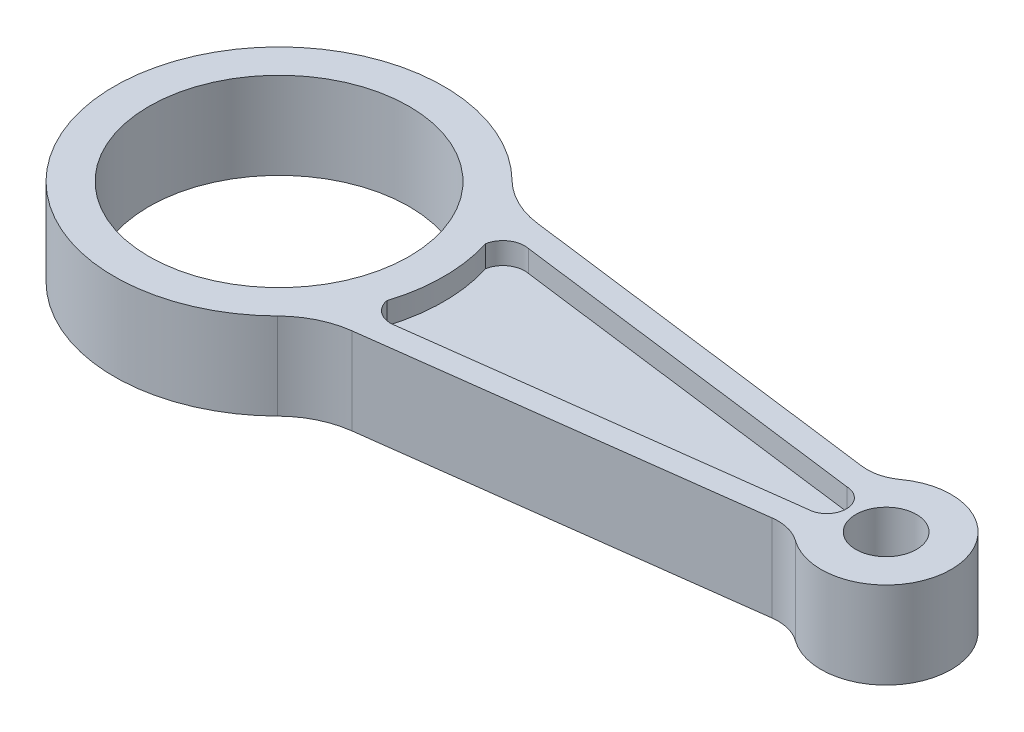
ISO-10303-21;
HEADER;
FILE_DESCRIPTION(('STEP AP214'),'2;1');
FILE_NAME('part.step','',(''),(''),'','','');
FILE_SCHEMA(('AUTOMOTIVE_DESIGN { 1 0 10303 214 1 1 1 1 }'));
ENDSEC;
DATA;
#1=APPLICATION_CONTEXT('core data for automotive mechanical design processes');
#2=APPLICATION_PROTOCOL_DEFINITION('international standard','automotive_design',2000,#1);
#3=PRODUCT_CONTEXT('',#1,'mechanical');
#4=PRODUCT('Part','Part','',(#3));
#5=PRODUCT_RELATED_PRODUCT_CATEGORY('part','',(#4));
#6=PRODUCT_DEFINITION_FORMATION('','',#4);
#7=PRODUCT_DEFINITION_CONTEXT('part definition',#1,'design');
#8=PRODUCT_DEFINITION('design','',#6,#7);
#9=PRODUCT_DEFINITION_SHAPE('','',#8);
#10=(LENGTH_UNIT() NAMED_UNIT(*) SI_UNIT(.MILLI.,.METRE.));
#11=(NAMED_UNIT(*) PLANE_ANGLE_UNIT() SI_UNIT($,.RADIAN.));
#12=(NAMED_UNIT(*) SI_UNIT($,.STERADIAN.) SOLID_ANGLE_UNIT());
#13=UNCERTAINTY_MEASURE_WITH_UNIT(LENGTH_MEASURE(1.E-05),#10,'distance_accuracy_value','');
#14=(GEOMETRIC_REPRESENTATION_CONTEXT(3) GLOBAL_UNCERTAINTY_ASSIGNED_CONTEXT((#13)) GLOBAL_UNIT_ASSIGNED_CONTEXT((#10,
#11,#12)) REPRESENTATION_CONTEXT('',''));
#15=CARTESIAN_POINT('',(0.,0.,0.));
#16=DIRECTION('',(0.,0.,1.));
#17=DIRECTION('',(1.,0.,0.));
#18=AXIS2_PLACEMENT_3D('',#15,#16,#17);
#19=CARTESIAN_POINT('',(0.,10.,0.));
#20=DIRECTION('',(0.,1.,0.));
#21=DIRECTION('',(0.,0.,1.));
#22=AXIS2_PLACEMENT_3D('',#19,#20,#21);
#23=PLANE('',#22);
#24=CARTESIAN_POINT('',(140.,10.,0.));
#25=DIRECTION('',(0.,1.,0.));
#26=DIRECTION('',(0.,0.,1.));
#27=AXIS2_PLACEMENT_3D('',#24,#25,#26);
#28=CIRCLE('',#27,7.00000000000001);
#29=CARTESIAN_POINT('',(140.,10.,7.00000000000001));
#30=VERTEX_POINT('',#29);
#31=EDGE_CURVE('E192',#30,#30,#28,.T.);
#32=ORIENTED_EDGE('',*,*,#31,.F.);
#33=EDGE_LOOP('',(#32));
#34=FACE_BOUND('',#33,.T.);
#35=DIRECTION('',(-0.991780070235736,0.,-0.127954258558278));
#36=VECTOR('',#35,1.);
#37=CARTESIAN_POINT('',(30.700703588536,10.,-22.3934543822263));
#38=LINE('',#37,#36);
#39=CARTESIAN_POINT('',(124.079148067427,10.,-10.3462576425481));
#40=VERTEX_POINT('',#39);
#41=CARTESIAN_POINT('',(38.2025768051587,10.,-21.4256020790408));
#42=VERTEX_POINT('',#41);
#43=EDGE_CURVE('E213',#40,#42,#38,.T.);
#44=ORIENTED_EDGE('',*,*,#43,.T.);
#45=CARTESIAN_POINT('',(40.7616619763243,10.,-41.2612034837555));
#46=DIRECTION('',(0.,1.,0.));
#47=DIRECTION('',(0.,0.,1.));
#48=AXIS2_PLACEMENT_3D('',#45,#46,#47);
#49=CIRCLE('',#48,20.);
#50=CARTESIAN_POINT('',(26.705916467247,10.,-27.0332022824605));
#51=VERTEX_POINT('',#50);
#52=EDGE_CURVE('E11',#42,#51,#49,.F.);
#53=ORIENTED_EDGE('',*,*,#52,.T.);
#54=CARTESIAN_POINT('',(0.,10.,0.));
#55=DIRECTION('',(0.,1.,0.));
#56=DIRECTION('',(0.,0.,1.));
#57=AXIS2_PLACEMENT_3D('',#54,#55,#56);
#58=CIRCLE('',#57,38.);
#59=CARTESIAN_POINT('',(26.705916467247,10.,27.0332022824605));
#60=VERTEX_POINT('',#59);
#61=EDGE_CURVE('E204',#51,#60,#58,.T.);
#62=ORIENTED_EDGE('',*,*,#61,.T.);
#63=CARTESIAN_POINT('',(40.7616619763243,10.,41.2612034837555));
#64=DIRECTION('',(0.,1.,0.));
#65=DIRECTION('',(0.,0.,1.));
#66=AXIS2_PLACEMENT_3D('',#63,#64,#65);
#67=CIRCLE('',#66,20.);
#68=CARTESIAN_POINT('',(38.2025768051587,10.,21.4256020790408));
#69=VERTEX_POINT('',#68);
#70=EDGE_CURVE('E256',#60,#69,#67,.F.);
#71=ORIENTED_EDGE('',*,*,#70,.T.);
#72=DIRECTION('',(0.991780070235736,0.,-0.127954258558278));
#73=VECTOR('',#72,1.);
#74=CARTESIAN_POINT('',(30.700703588536,10.,22.3934543822263));
#75=LINE('',#74,#73);
#76=CARTESIAN_POINT('',(124.079148067427,10.,10.3462576425481));
#77=VERTEX_POINT('',#76);
#78=EDGE_CURVE('E207',#69,#77,#75,.T.);
#79=ORIENTED_EDGE('',*,*,#78,.T.);
#80=CARTESIAN_POINT('',(125.35869065301,10.,20.2640583449055));
#81=DIRECTION('',(0.,1.,0.));
#82=DIRECTION('',(0.,0.,1.));
#83=AXIS2_PLACEMENT_3D('',#80,#81,#82);
#84=CIRCLE('',#83,10.);
#85=CARTESIAN_POINT('',(131.215214391806,10.,12.1584350069433));
#86=VERTEX_POINT('',#85);
#87=EDGE_CURVE('E238',#77,#86,#84,.F.);
#88=ORIENTED_EDGE('',*,*,#87,.T.);
#89=CARTESIAN_POINT('',(140.,10.,0.));
#90=DIRECTION('',(0.,1.,0.));
#91=DIRECTION('',(0.,0.,-1.));
#92=AXIS2_PLACEMENT_3D('',#89,#90,#91);
#93=CIRCLE('',#92,15.);
#94=CARTESIAN_POINT('',(131.215214391806,10.,-12.1584350069433));
#95=VERTEX_POINT('',#94);
#96=EDGE_CURVE('E210',#86,#95,#93,.T.);
#97=ORIENTED_EDGE('',*,*,#96,.T.);
#98=CARTESIAN_POINT('',(125.35869065301,10.,-20.2640583449055));
#99=DIRECTION('',(0.,1.,0.));
#100=DIRECTION('',(0.,0.,1.));
#101=AXIS2_PLACEMENT_3D('',#98,#99,#100);
#102=CIRCLE('',#101,10.);
#103=EDGE_CURVE('E242',#95,#40,#102,.F.);
#104=ORIENTED_EDGE('',*,*,#103,.T.);
#105=EDGE_LOOP('',(#44,#53,#62,#71,#79,#88,#97,#104));
#106=FACE_BOUND('',#105,.T.);
#107=CARTESIAN_POINT('',(0.,10.,0.));
#108=DIRECTION('',(0.,1.,0.));
#109=DIRECTION('',(0.,0.,1.));
#110=AXIS2_PLACEMENT_3D('',#107,#108,#109);
#111=CIRCLE('',#110,30.);
#112=CARTESIAN_POINT('',(0.,10.,30.));
#113=VERTEX_POINT('',#112);
#114=EDGE_CURVE('E198',#113,#113,#111,.T.);
#115=ORIENTED_EDGE('',*,*,#114,.F.);
#116=EDGE_LOOP('',(#115));
#117=FACE_BOUND('',#116,.T.);
#118=CARTESIAN_POINT('',(41.1592606303604,10.,-10.4663537764258));
#119=DIRECTION('',(0.,1.,0.));
#120=DIRECTION('',(0.,0.,-1.));
#121=AXIS2_PLACEMENT_3D('',#118,#119,#120);
#122=CIRCLE('',#121,5.);
#123=CARTESIAN_POINT('',(42.097828348482,10.,-15.377472858519));
#124=VERTEX_POINT('',#123);
#125=CARTESIAN_POINT('',(36.2481415482672,10.,-11.4049214945473));
#126=VERTEX_POINT('',#125);
#127=EDGE_CURVE('E52',#124,#126,#122,.T.);
#128=ORIENTED_EDGE('',*,*,#127,.F.);
#129=DIRECTION('',(-0.991780070235736,0.,-0.127954258558278));
#130=VECTOR('',#129,1.);
#131=CARTESIAN_POINT('',(42.097828348482,10.,-15.377472858519));
#132=LINE('',#131,#130);
#133=CARTESIAN_POINT('',(126.41828508729,10.,-4.49889014940578));
#134=VERTEX_POINT('',#133);
#135=EDGE_CURVE('E158',#134,#124,#132,.T.);
#136=ORIENTED_EDGE('',*,*,#135,.F.);
#137=CARTESIAN_POINT('',(126.318347989175,10.,0.));
#138=DIRECTION('',(0.,1.,0.));
#139=DIRECTION('',(0.,0.,-1.));
#140=AXIS2_PLACEMENT_3D('',#137,#138,#139);
#141=CIRCLE('',#140,4.5);
#142=CARTESIAN_POINT('',(126.41828508729,10.,4.49889014940578));
#143=VERTEX_POINT('',#142);
#144=EDGE_CURVE('E161',#143,#134,#141,.T.);
#145=ORIENTED_EDGE('',*,*,#144,.F.);
#146=DIRECTION('',(0.991780070235736,0.,-0.127954258558278));
#147=VECTOR('',#146,1.);
#148=CARTESIAN_POINT('',(42.097828348482,10.,15.377472858519));
#149=LINE('',#148,#147);
#150=CARTESIAN_POINT('',(42.097828348482,10.,15.377472858519));
#151=VERTEX_POINT('',#150);
#152=EDGE_CURVE('E177',#151,#143,#149,.T.);
#153=ORIENTED_EDGE('',*,*,#152,.F.);
#154=CARTESIAN_POINT('',(41.1592606303604,10.,10.4663537764258));
#155=DIRECTION('',(0.,1.,0.));
#156=DIRECTION('',(0.,0.,1.));
#157=AXIS2_PLACEMENT_3D('',#154,#155,#156);
#158=CIRCLE('',#157,5.);
#159=CARTESIAN_POINT('',(36.2481415482672,10.,11.4049214945473));
#160=VERTEX_POINT('',#159);
#161=EDGE_CURVE('E174',#160,#151,#158,.T.);
#162=ORIENTED_EDGE('',*,*,#161,.F.);
#163=CARTESIAN_POINT('',(0.,10.,0.));
#164=DIRECTION('',(0.,-1.,0.));
#165=DIRECTION('',(0.,0.,-1.));
#166=AXIS2_PLACEMENT_3D('',#163,#164,#165);
#167=CIRCLE('',#166,38.);
#168=EDGE_CURVE('E172',#126,#160,#167,.T.);
#169=ORIENTED_EDGE('',*,*,#168,.F.);
#170=EDGE_LOOP('',(#128,#136,#145,#153,#162,#169));
#171=FACE_BOUND('',#170,.T.);
#172=ADVANCED_FACE('F37',(#34,#106,#117,#171),#23,.T.);
#173=CARTESIAN_POINT('',(0.,-10.,0.));
#174=DIRECTION('',(0.,1.,0.));
#175=DIRECTION('',(0.,0.,1.));
#176=AXIS2_PLACEMENT_3D('',#173,#174,#175);
#177=PLANE('',#176);
#178=CARTESIAN_POINT('',(0.,-10.,0.));
#179=DIRECTION('',(0.,1.,0.));
#180=DIRECTION('',(0.,0.,1.));
#181=AXIS2_PLACEMENT_3D('',#178,#179,#180);
#182=CIRCLE('',#181,38.);
#183=CARTESIAN_POINT('',(26.705916467247,-10.,-27.0332022824605));
#184=VERTEX_POINT('',#183);
#185=CARTESIAN_POINT('',(26.705916467247,-10.,27.0332022824605));
#186=VERTEX_POINT('',#185);
#187=EDGE_CURVE('E201',#184,#186,#182,.T.);
#188=ORIENTED_EDGE('',*,*,#187,.F.);
#189=CARTESIAN_POINT('',(40.7616619763243,-10.,-41.2612034837555));
#190=DIRECTION('',(0.,1.,0.));
#191=DIRECTION('',(0.,0.,1.));
#192=AXIS2_PLACEMENT_3D('',#189,#190,#191);
#193=CIRCLE('',#192,20.);
#194=CARTESIAN_POINT('',(38.2025768051587,-10.,-21.4256020790408));
#195=VERTEX_POINT('',#194);
#196=EDGE_CURVE('E45',#184,#195,#193,.T.);
#197=ORIENTED_EDGE('',*,*,#196,.T.);
#198=DIRECTION('',(-0.991780070235736,0.,-0.127954258558278));
#199=VECTOR('',#198,1.);
#200=CARTESIAN_POINT('',(30.700703588536,-10.,-22.3934543822263));
#201=LINE('',#200,#199);
#202=CARTESIAN_POINT('',(124.079148067427,-10.,-10.3462576425481));
#203=VERTEX_POINT('',#202);
#204=EDGE_CURVE('E208',#203,#195,#201,.T.);
#205=ORIENTED_EDGE('',*,*,#204,.F.);
#206=CARTESIAN_POINT('',(125.35869065301,-10.,-20.2640583449055));
#207=DIRECTION('',(0.,1.,0.));
#208=DIRECTION('',(0.,0.,1.));
#209=AXIS2_PLACEMENT_3D('',#206,#207,#208);
#210=CIRCLE('',#209,10.);
#211=CARTESIAN_POINT('',(131.215214391806,-10.,-12.1584350069433));
#212=VERTEX_POINT('',#211);
#213=EDGE_CURVE('E240',#203,#212,#210,.T.);
#214=ORIENTED_EDGE('',*,*,#213,.T.);
#215=CARTESIAN_POINT('',(140.,-10.,0.));
#216=DIRECTION('',(0.,1.,0.));
#217=DIRECTION('',(0.,0.,-1.));
#218=AXIS2_PLACEMENT_3D('',#215,#216,#217);
#219=CIRCLE('',#218,15.);
#220=CARTESIAN_POINT('',(131.215214391806,-10.,12.1584350069433));
#221=VERTEX_POINT('',#220);
#222=EDGE_CURVE('E221',#221,#212,#219,.T.);
#223=ORIENTED_EDGE('',*,*,#222,.F.);
#224=CARTESIAN_POINT('',(125.35869065301,-10.,20.2640583449055));
#225=DIRECTION('',(0.,1.,0.));
#226=DIRECTION('',(0.,0.,1.));
#227=AXIS2_PLACEMENT_3D('',#224,#225,#226);
#228=CIRCLE('',#227,10.);
#229=CARTESIAN_POINT('',(124.079148067427,-10.,10.3462576425481));
#230=VERTEX_POINT('',#229);
#231=EDGE_CURVE('E235',#221,#230,#228,.T.);
#232=ORIENTED_EDGE('',*,*,#231,.T.);
#233=DIRECTION('',(0.991780070235736,0.,-0.127954258558278));
#234=VECTOR('',#233,1.);
#235=CARTESIAN_POINT('',(30.700703588536,-10.,22.3934543822263));
#236=LINE('',#235,#234);
#237=CARTESIAN_POINT('',(38.2025768051587,-10.,21.4256020790408));
#238=VERTEX_POINT('',#237);
#239=EDGE_CURVE('E219',#238,#230,#236,.T.);
#240=ORIENTED_EDGE('',*,*,#239,.F.);
#241=CARTESIAN_POINT('',(40.7616619763243,-10.,41.2612034837555));
#242=DIRECTION('',(0.,1.,0.));
#243=DIRECTION('',(0.,0.,1.));
#244=AXIS2_PLACEMENT_3D('',#241,#242,#243);
#245=CIRCLE('',#244,20.);
#246=EDGE_CURVE('E254',#238,#186,#245,.T.);
#247=ORIENTED_EDGE('',*,*,#246,.T.);
#248=EDGE_LOOP('',(#188,#197,#205,#214,#223,#232,#240,#247));
#249=FACE_BOUND('',#248,.T.);
#250=CARTESIAN_POINT('',(0.,-10.,0.));
#251=DIRECTION('',(0.,1.,0.));
#252=DIRECTION('',(0.,0.,1.));
#253=AXIS2_PLACEMENT_3D('',#250,#251,#252);
#254=CIRCLE('',#253,30.);
#255=CARTESIAN_POINT('',(0.,-10.,30.));
#256=VERTEX_POINT('',#255);
#257=EDGE_CURVE('E195',#256,#256,#254,.T.);
#258=ORIENTED_EDGE('',*,*,#257,.T.);
#259=EDGE_LOOP('',(#258));
#260=FACE_BOUND('',#259,.T.);
#261=CARTESIAN_POINT('',(140.,-10.,0.));
#262=DIRECTION('',(0.,1.,0.));
#263=DIRECTION('',(0.,0.,1.));
#264=AXIS2_PLACEMENT_3D('',#261,#262,#263);
#265=CIRCLE('',#264,7.00000000000001);
#266=CARTESIAN_POINT('',(140.,-10.,7.00000000000001));
#267=VERTEX_POINT('',#266);
#268=EDGE_CURVE('E184',#267,#267,#265,.T.);
#269=ORIENTED_EDGE('',*,*,#268,.T.);
#270=EDGE_LOOP('',(#269));
#271=FACE_BOUND('',#270,.T.);
#272=ADVANCED_FACE('F271',(#249,#260,#271),#177,.F.);
#273=CARTESIAN_POINT('',(0.,10.,0.));
#274=DIRECTION('',(0.,-1.,0.));
#275=DIRECTION('',(0.,0.,-1.));
#276=AXIS2_PLACEMENT_3D('',#273,#274,#275);
#277=CYLINDRICAL_SURFACE('',#276,38.);
#278=ORIENTED_EDGE('',*,*,#187,.T.);
#279=DIRECTION('',(0.,-1.,0.));
#280=VECTOR('',#279,1.);
#281=CARTESIAN_POINT('',(26.705916467247,10.,27.0332022824605));
#282=LINE('',#281,#280);
#283=EDGE_CURVE('E250',#186,#60,#282,.F.);
#284=ORIENTED_EDGE('',*,*,#283,.T.);
#285=ORIENTED_EDGE('',*,*,#61,.F.);
#286=DIRECTION('',(0.,-1.,0.));
#287=VECTOR('',#286,1.);
#288=CARTESIAN_POINT('',(26.705916467247,10.,-27.0332022824605));
#289=LINE('',#288,#287);
#290=EDGE_CURVE('E247',#51,#184,#289,.T.);
#291=ORIENTED_EDGE('',*,*,#290,.T.);
#292=EDGE_LOOP('',(#278,#284,#285,#291));
#293=FACE_BOUND('',#292,.T.);
#294=ADVANCED_FACE('F274',(#293),#277,.T.);
#295=CARTESIAN_POINT('',(30.700703588536,10.,22.3934543822263));
#296=DIRECTION('',(-0.127954258558278,0.,-0.991780070235736));
#297=DIRECTION('',(-0.991780070235736,0.,0.127954258558278));
#298=AXIS2_PLACEMENT_3D('',#295,#296,#297);
#299=PLANE('',#298);
#300=ORIENTED_EDGE('',*,*,#78,.F.);
#301=DIRECTION('',(0.,1.,0.));
#302=VECTOR('',#301,1.);
#303=CARTESIAN_POINT('',(38.2025768051587,-10.,21.4256020790408));
#304=LINE('',#303,#302);
#305=EDGE_CURVE('E244',#69,#238,#304,.F.);
#306=ORIENTED_EDGE('',*,*,#305,.T.);
#307=ORIENTED_EDGE('',*,*,#239,.T.);
#308=DIRECTION('',(0.,1.,0.));
#309=VECTOR('',#308,1.);
#310=CARTESIAN_POINT('',(124.079148067427,10.,10.3462576425481));
#311=LINE('',#310,#309);
#312=EDGE_CURVE('E229',#230,#77,#311,.T.);
#313=ORIENTED_EDGE('',*,*,#312,.T.);
#314=EDGE_LOOP('',(#300,#306,#307,#313));
#315=FACE_BOUND('',#314,.T.);
#316=ADVANCED_FACE('F266',(#315),#299,.F.);
#317=CARTESIAN_POINT('',(140.,10.,0.));
#318=DIRECTION('',(0.,-1.,0.));
#319=DIRECTION('',(0.,0.,-1.));
#320=AXIS2_PLACEMENT_3D('',#317,#318,#319);
#321=CYLINDRICAL_SURFACE('',#320,15.);
#322=ORIENTED_EDGE('',*,*,#96,.F.);
#323=DIRECTION('',(0.,-1.,0.));
#324=VECTOR('',#323,1.);
#325=CARTESIAN_POINT('',(131.215214391806,10.,12.1584350069433));
#326=LINE('',#325,#324);
#327=EDGE_CURVE('E226',#86,#221,#326,.T.);
#328=ORIENTED_EDGE('',*,*,#327,.T.);
#329=ORIENTED_EDGE('',*,*,#222,.T.);
#330=DIRECTION('',(0.,-1.,0.));
#331=VECTOR('',#330,1.);
#332=CARTESIAN_POINT('',(131.215214391806,10.,-12.1584350069433));
#333=LINE('',#332,#331);
#334=EDGE_CURVE('E216',#212,#95,#333,.F.);
#335=ORIENTED_EDGE('',*,*,#334,.T.);
#336=EDGE_LOOP('',(#322,#328,#329,#335));
#337=FACE_BOUND('',#336,.T.);
#338=ADVANCED_FACE('F290',(#337),#321,.T.);
#339=CARTESIAN_POINT('',(30.700703588536,10.,-22.3934543822263));
#340=DIRECTION('',(-0.127954258558278,0.,0.991780070235736));
#341=DIRECTION('',(0.991780070235736,0.,0.127954258558278));
#342=AXIS2_PLACEMENT_3D('',#339,#340,#341);
#343=PLANE('',#342);
#344=ORIENTED_EDGE('',*,*,#204,.T.);
#345=DIRECTION('',(0.,1.,0.));
#346=VECTOR('',#345,1.);
#347=CARTESIAN_POINT('',(38.2025768051587,10.,-21.4256020790408));
#348=LINE('',#347,#346);
#349=EDGE_CURVE('E252',#195,#42,#348,.T.);
#350=ORIENTED_EDGE('',*,*,#349,.T.);
#351=ORIENTED_EDGE('',*,*,#43,.F.);
#352=DIRECTION('',(0.,1.,0.));
#353=VECTOR('',#352,1.);
#354=CARTESIAN_POINT('',(124.079148067427,-10.,-10.3462576425481));
#355=LINE('',#354,#353);
#356=EDGE_CURVE('E232',#40,#203,#355,.F.);
#357=ORIENTED_EDGE('',*,*,#356,.T.);
#358=EDGE_LOOP('',(#344,#350,#351,#357));
#359=FACE_BOUND('',#358,.T.);
#360=ADVANCED_FACE('F281',(#359),#343,.F.);
#361=CARTESIAN_POINT('',(0.,10.,0.));
#362=DIRECTION('',(0.,-1.,0.));
#363=DIRECTION('',(0.,0.,-1.));
#364=AXIS2_PLACEMENT_3D('',#361,#362,#363);
#365=CYLINDRICAL_SURFACE('',#364,30.);
#366=ORIENTED_EDGE('',*,*,#114,.T.);
#367=EDGE_LOOP('',(#366));
#368=FACE_BOUND('',#367,.T.);
#369=ORIENTED_EDGE('',*,*,#257,.F.);
#370=EDGE_LOOP('',(#369));
#371=FACE_BOUND('',#370,.T.);
#372=ADVANCED_FACE('F302',(#368,#371),#365,.F.);
#373=CARTESIAN_POINT('',(140.,10.,0.));
#374=DIRECTION('',(0.,-1.,0.));
#375=DIRECTION('',(0.,0.,-1.));
#376=AXIS2_PLACEMENT_3D('',#373,#374,#375);
#377=CYLINDRICAL_SURFACE('',#376,7.00000000000001);
#378=ORIENTED_EDGE('',*,*,#31,.T.);
#379=EDGE_LOOP('',(#378));
#380=FACE_BOUND('',#379,.T.);
#381=ORIENTED_EDGE('',*,*,#268,.F.);
#382=EDGE_LOOP('',(#381));
#383=FACE_BOUND('',#382,.T.);
#384=ADVANCED_FACE('F295',(#380,#383),#377,.F.);
#385=CARTESIAN_POINT('',(125.35869065301,10.,20.2640583449055));
#386=DIRECTION('',(0.,-1.,0.));
#387=DIRECTION('',(0.,0.,-1.));
#388=AXIS2_PLACEMENT_3D('',#385,#386,#387);
#389=CYLINDRICAL_SURFACE('',#388,10.);
#390=ORIENTED_EDGE('',*,*,#87,.F.);
#391=ORIENTED_EDGE('',*,*,#312,.F.);
#392=ORIENTED_EDGE('',*,*,#231,.F.);
#393=ORIENTED_EDGE('',*,*,#327,.F.);
#394=EDGE_LOOP('',(#390,#391,#392,#393));
#395=FACE_BOUND('',#394,.T.);
#396=ADVANCED_FACE('F293',(#395),#389,.F.);
#397=CARTESIAN_POINT('',(125.35869065301,10.,-20.2640583449055));
#398=DIRECTION('',(0.,-1.,0.));
#399=DIRECTION('',(0.,0.,-1.));
#400=AXIS2_PLACEMENT_3D('',#397,#398,#399);
#401=CYLINDRICAL_SURFACE('',#400,10.);
#402=ORIENTED_EDGE('',*,*,#103,.F.);
#403=ORIENTED_EDGE('',*,*,#334,.F.);
#404=ORIENTED_EDGE('',*,*,#213,.F.);
#405=ORIENTED_EDGE('',*,*,#356,.F.);
#406=EDGE_LOOP('',(#402,#403,#404,#405));
#407=FACE_BOUND('',#406,.T.);
#408=ADVANCED_FACE('F287',(#407),#401,.F.);
#409=CARTESIAN_POINT('',(40.7616619763243,10.,41.2612034837555));
#410=DIRECTION('',(0.,-1.,0.));
#411=DIRECTION('',(0.,0.,-1.));
#412=AXIS2_PLACEMENT_3D('',#409,#410,#411);
#413=CYLINDRICAL_SURFACE('',#412,20.);
#414=ORIENTED_EDGE('',*,*,#70,.F.);
#415=ORIENTED_EDGE('',*,*,#283,.F.);
#416=ORIENTED_EDGE('',*,*,#246,.F.);
#417=ORIENTED_EDGE('',*,*,#305,.F.);
#418=EDGE_LOOP('',(#414,#415,#416,#417));
#419=FACE_BOUND('',#418,.T.);
#420=ADVANCED_FACE('F270',(#419),#413,.F.);
#421=CARTESIAN_POINT('',(40.7616619763243,10.,-41.2612034837555));
#422=DIRECTION('',(0.,-1.,0.));
#423=DIRECTION('',(0.,0.,-1.));
#424=AXIS2_PLACEMENT_3D('',#421,#422,#423);
#425=CYLINDRICAL_SURFACE('',#424,20.);
#426=ORIENTED_EDGE('',*,*,#52,.F.);
#427=ORIENTED_EDGE('',*,*,#349,.F.);
#428=ORIENTED_EDGE('',*,*,#196,.F.);
#429=ORIENTED_EDGE('',*,*,#290,.F.);
#430=EDGE_LOOP('',(#426,#427,#428,#429));
#431=FACE_BOUND('',#430,.T.);
#432=ADVANCED_FACE('F39',(#431),#425,.F.);
#433=CARTESIAN_POINT('',(41.1592606303604,5.,-10.4663537764258));
#434=DIRECTION('',(0.,1.,0.));
#435=DIRECTION('',(0.,0.,1.));
#436=AXIS2_PLACEMENT_3D('',#433,#434,#435);
#437=CYLINDRICAL_SURFACE('',#436,5.);
#438=ORIENTED_EDGE('',*,*,#127,.T.);
#439=DIRECTION('',(0.,1.,0.));
#440=VECTOR('',#439,1.);
#441=CARTESIAN_POINT('',(36.2481415482672,5.,-11.4049214945473));
#442=LINE('',#441,#440);
#443=CARTESIAN_POINT('',(36.2481415482672,5.,-11.4049214945473));
#444=VERTEX_POINT('',#443);
#445=EDGE_CURVE('E135',#444,#126,#442,.T.);
#446=ORIENTED_EDGE('',*,*,#445,.F.);
#447=CARTESIAN_POINT('',(41.1592606303604,5.,-10.4663537764258));
#448=DIRECTION('',(0.,1.,0.));
#449=DIRECTION('',(0.,0.,-1.));
#450=AXIS2_PLACEMENT_3D('',#447,#448,#449);
#451=CIRCLE('',#450,5.);
#452=CARTESIAN_POINT('',(42.097828348482,5.,-15.377472858519));
#453=VERTEX_POINT('',#452);
#454=EDGE_CURVE('E139',#453,#444,#451,.T.);
#455=ORIENTED_EDGE('',*,*,#454,.F.);
#456=DIRECTION('',(0.,1.,0.));
#457=VECTOR('',#456,1.);
#458=CARTESIAN_POINT('',(42.097828348482,5.,-15.377472858519));
#459=LINE('',#458,#457);
#460=EDGE_CURVE('E182',#453,#124,#459,.T.);
#461=ORIENTED_EDGE('',*,*,#460,.T.);
#462=EDGE_LOOP('',(#438,#446,#455,#461));
#463=FACE_BOUND('',#462,.T.);
#464=ADVANCED_FACE('F137',(#463),#437,.F.);
#465=CARTESIAN_POINT('',(42.097828348482,5.,-15.377472858519));
#466=DIRECTION('',(0.127954258558278,0.,-0.991780070235736));
#467=DIRECTION('',(-0.991780070235736,0.,-0.127954258558278));
#468=AXIS2_PLACEMENT_3D('',#465,#466,#467);
#469=PLANE('',#468);
#470=ORIENTED_EDGE('',*,*,#135,.T.);
#471=ORIENTED_EDGE('',*,*,#460,.F.);
#472=DIRECTION('',(-0.991780070235736,0.,-0.127954258558278));
#473=VECTOR('',#472,1.);
#474=CARTESIAN_POINT('',(42.097828348482,5.,-15.377472858519));
#475=LINE('',#474,#473);
#476=CARTESIAN_POINT('',(126.41828508729,5.,-4.49889014940578));
#477=VERTEX_POINT('',#476);
#478=EDGE_CURVE('E145',#477,#453,#475,.T.);
#479=ORIENTED_EDGE('',*,*,#478,.F.);
#480=DIRECTION('',(0.,1.,0.));
#481=VECTOR('',#480,1.);
#482=CARTESIAN_POINT('',(126.41828508729,5.,-4.49889014940578));
#483=LINE('',#482,#481);
#484=EDGE_CURVE('E185',#477,#134,#483,.T.);
#485=ORIENTED_EDGE('',*,*,#484,.T.);
#486=EDGE_LOOP('',(#470,#471,#479,#485));
#487=FACE_BOUND('',#486,.T.);
#488=ADVANCED_FACE('F385',(#487),#469,.F.);
#489=CARTESIAN_POINT('',(126.318347989175,5.,0.));
#490=DIRECTION('',(0.,1.,0.));
#491=DIRECTION('',(0.,0.,1.));
#492=AXIS2_PLACEMENT_3D('',#489,#490,#491);
#493=CYLINDRICAL_SURFACE('',#492,4.5);
#494=ORIENTED_EDGE('',*,*,#144,.T.);
#495=ORIENTED_EDGE('',*,*,#484,.F.);
#496=CARTESIAN_POINT('',(126.318347989175,5.,0.));
#497=DIRECTION('',(0.,1.,0.));
#498=DIRECTION('',(0.,0.,-1.));
#499=AXIS2_PLACEMENT_3D('',#496,#497,#498);
#500=CIRCLE('',#499,4.5);
#501=CARTESIAN_POINT('',(126.41828508729,5.,4.49889014940578));
#502=VERTEX_POINT('',#501);
#503=EDGE_CURVE('E168',#502,#477,#500,.T.);
#504=ORIENTED_EDGE('',*,*,#503,.F.);
#505=DIRECTION('',(0.,1.,0.));
#506=VECTOR('',#505,1.);
#507=CARTESIAN_POINT('',(126.41828508729,5.,4.49889014940578));
#508=LINE('',#507,#506);
#509=EDGE_CURVE('E187',#502,#143,#508,.T.);
#510=ORIENTED_EDGE('',*,*,#509,.T.);
#511=EDGE_LOOP('',(#494,#495,#504,#510));
#512=FACE_BOUND('',#511,.T.);
#513=ADVANCED_FACE('F393',(#512),#493,.F.);
#514=CARTESIAN_POINT('',(42.097828348482,5.,15.377472858519));
#515=DIRECTION('',(0.127954258558278,0.,0.991780070235736));
#516=DIRECTION('',(0.991780070235736,0.,-0.127954258558278));
#517=AXIS2_PLACEMENT_3D('',#514,#515,#516);
#518=PLANE('',#517);
#519=ORIENTED_EDGE('',*,*,#152,.T.);
#520=ORIENTED_EDGE('',*,*,#509,.F.);
#521=DIRECTION('',(0.991780070235736,0.,-0.127954258558278));
#522=VECTOR('',#521,1.);
#523=CARTESIAN_POINT('',(42.097828348482,5.,15.377472858519));
#524=LINE('',#523,#522);
#525=CARTESIAN_POINT('',(42.097828348482,5.,15.377472858519));
#526=VERTEX_POINT('',#525);
#527=EDGE_CURVE('E165',#526,#502,#524,.T.);
#528=ORIENTED_EDGE('',*,*,#527,.F.);
#529=DIRECTION('',(0.,1.,0.));
#530=VECTOR('',#529,1.);
#531=CARTESIAN_POINT('',(42.097828348482,5.,15.377472858519));
#532=LINE('',#531,#530);
#533=EDGE_CURVE('E189',#526,#151,#532,.T.);
#534=ORIENTED_EDGE('',*,*,#533,.T.);
#535=EDGE_LOOP('',(#519,#520,#528,#534));
#536=FACE_BOUND('',#535,.T.);
#537=ADVANCED_FACE('F402',(#536),#518,.F.);
#538=CARTESIAN_POINT('',(41.1592606303604,5.,10.4663537764258));
#539=DIRECTION('',(0.,1.,0.));
#540=DIRECTION('',(0.,0.,1.));
#541=AXIS2_PLACEMENT_3D('',#538,#539,#540);
#542=CYLINDRICAL_SURFACE('',#541,5.);
#543=ORIENTED_EDGE('',*,*,#161,.T.);
#544=ORIENTED_EDGE('',*,*,#533,.F.);
#545=CARTESIAN_POINT('',(41.1592606303604,5.,10.4663537764258));
#546=DIRECTION('',(0.,1.,0.));
#547=DIRECTION('',(0.,0.,1.));
#548=AXIS2_PLACEMENT_3D('',#545,#546,#547);
#549=CIRCLE('',#548,5.);
#550=CARTESIAN_POINT('',(36.2481415482672,5.,11.4049214945473));
#551=VERTEX_POINT('',#550);
#552=EDGE_CURVE('E153',#551,#526,#549,.T.);
#553=ORIENTED_EDGE('',*,*,#552,.F.);
#554=DIRECTION('',(0.,1.,0.));
#555=VECTOR('',#554,1.);
#556=CARTESIAN_POINT('',(36.2481415482672,5.,11.4049214945473));
#557=LINE('',#556,#555);
#558=EDGE_CURVE('E144',#551,#160,#557,.T.);
#559=ORIENTED_EDGE('',*,*,#558,.T.);
#560=EDGE_LOOP('',(#543,#544,#553,#559));
#561=FACE_BOUND('',#560,.T.);
#562=ADVANCED_FACE('F411',(#561),#542,.F.);
#563=CARTESIAN_POINT('',(0.,5.,0.));
#564=DIRECTION('',(0.,1.,0.));
#565=DIRECTION('',(0.,0.,1.));
#566=AXIS2_PLACEMENT_3D('',#563,#564,#565);
#567=CYLINDRICAL_SURFACE('',#566,38.);
#568=ORIENTED_EDGE('',*,*,#168,.T.);
#569=ORIENTED_EDGE('',*,*,#558,.F.);
#570=CARTESIAN_POINT('',(0.,5.,0.));
#571=DIRECTION('',(0.,-1.,0.));
#572=DIRECTION('',(0.,0.,-1.));
#573=AXIS2_PLACEMENT_3D('',#570,#571,#572);
#574=CIRCLE('',#573,38.);
#575=EDGE_CURVE('E148',#444,#551,#574,.T.);
#576=ORIENTED_EDGE('',*,*,#575,.F.);
#577=ORIENTED_EDGE('',*,*,#445,.T.);
#578=EDGE_LOOP('',(#568,#569,#576,#577));
#579=FACE_BOUND('',#578,.T.);
#580=ADVANCED_FACE('F149',(#579),#567,.T.);
#581=CARTESIAN_POINT('',(41.1592606303604,5.,-10.4663537764258));
#582=DIRECTION('',(0.,-1.,0.));
#583=DIRECTION('',(0.,0.,-1.));
#584=AXIS2_PLACEMENT_3D('',#581,#582,#583);
#585=PLANE('',#584);
#586=ORIENTED_EDGE('',*,*,#454,.T.);
#587=ORIENTED_EDGE('',*,*,#575,.T.);
#588=ORIENTED_EDGE('',*,*,#552,.T.);
#589=ORIENTED_EDGE('',*,*,#527,.T.);
#590=ORIENTED_EDGE('',*,*,#503,.T.);
#591=ORIENTED_EDGE('',*,*,#478,.T.);
#592=EDGE_LOOP('',(#586,#587,#588,#589,#590,#591));
#593=FACE_BOUND('',#592,.T.);
#594=ADVANCED_FACE('F155',(#593),#585,.F.);
#595=CLOSED_SHELL('',(#172,#272,#294,#316,#338,#360,#372,#384,#396,#408,#420,#432,#464,#488,
#513,#537,#562,#580,#594));
#596=MANIFOLD_SOLID_BREP('B2',#595);
#597=ADVANCED_BREP_SHAPE_REPRESENTATION('',(#18,#596),#14);
#598=SHAPE_DEFINITION_REPRESENTATION(#9,#597);
ENDSEC;
END-ISO-10303-21;
